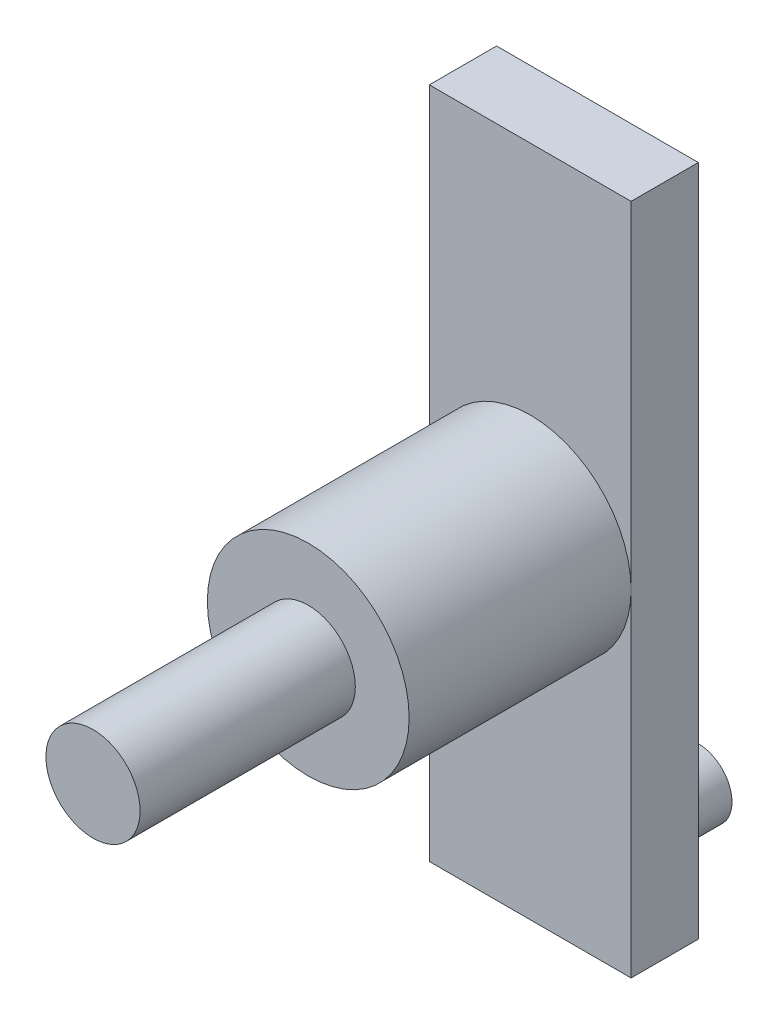
ISO-10303-21;
HEADER;
FILE_DESCRIPTION(('STEP AP214'),'2;1');
FILE_NAME('part.step','',(''),(''),'','','');
FILE_SCHEMA(('AUTOMOTIVE_DESIGN { 1 0 10303 214 1 1 1 1 }'));
ENDSEC;
DATA;
#1=APPLICATION_CONTEXT('core data for automotive mechanical design processes');
#2=APPLICATION_PROTOCOL_DEFINITION('international standard','automotive_design',2000,#1);
#3=PRODUCT_CONTEXT('',#1,'mechanical');
#4=PRODUCT('Part','Part','',(#3));
#5=PRODUCT_RELATED_PRODUCT_CATEGORY('part','',(#4));
#6=PRODUCT_DEFINITION_FORMATION('','',#4);
#7=PRODUCT_DEFINITION_CONTEXT('part definition',#1,'design');
#8=PRODUCT_DEFINITION('design','',#6,#7);
#9=PRODUCT_DEFINITION_SHAPE('','',#8);
#10=(LENGTH_UNIT() NAMED_UNIT(*) SI_UNIT(.MILLI.,.METRE.));
#11=(NAMED_UNIT(*) PLANE_ANGLE_UNIT() SI_UNIT($,.RADIAN.));
#12=(NAMED_UNIT(*) SI_UNIT($,.STERADIAN.) SOLID_ANGLE_UNIT());
#13=UNCERTAINTY_MEASURE_WITH_UNIT(LENGTH_MEASURE(1.E-05),#10,'distance_accuracy_value','');
#14=(GEOMETRIC_REPRESENTATION_CONTEXT(3) GLOBAL_UNCERTAINTY_ASSIGNED_CONTEXT((#13)) GLOBAL_UNIT_ASSIGNED_CONTEXT((#10,
#11,#12)) REPRESENTATION_CONTEXT('',''));
#15=CARTESIAN_POINT('',(0.,0.,0.));
#16=DIRECTION('',(0.,0.,1.));
#17=DIRECTION('',(1.,0.,0.));
#18=AXIS2_PLACEMENT_3D('',#15,#16,#17);
#19=CARTESIAN_POINT('',(0.,0.,65.));
#20=DIRECTION('',(0.,0.,-1.));
#21=DIRECTION('',(-1.,0.,0.));
#22=AXIS2_PLACEMENT_3D('',#19,#20,#21);
#23=CYLINDRICAL_SURFACE('',#22,7.);
#24=CARTESIAN_POINT('',(0.,0.,33.));
#25=DIRECTION('',(0.,0.,1.));
#26=DIRECTION('',(1.,0.,0.));
#27=AXIS2_PLACEMENT_3D('',#24,#25,#26);
#28=CIRCLE('',#27,7.);
#29=CARTESIAN_POINT('',(7.,0.,33.));
#30=VERTEX_POINT('',#29);
#31=EDGE_CURVE('E111',#30,#30,#28,.T.);
#32=ORIENTED_EDGE('',*,*,#31,.T.);
#33=EDGE_LOOP('',(#32));
#34=FACE_BOUND('',#33,.T.);
#35=CARTESIAN_POINT('',(0.,0.,65.));
#36=DIRECTION('',(0.,0.,1.));
#37=DIRECTION('',(1.,0.,0.));
#38=AXIS2_PLACEMENT_3D('',#35,#36,#37);
#39=CIRCLE('',#38,7.);
#40=CARTESIAN_POINT('',(7.,0.,65.));
#41=VERTEX_POINT('',#40);
#42=EDGE_CURVE('E48',#41,#41,#39,.T.);
#43=ORIENTED_EDGE('',*,*,#42,.F.);
#44=EDGE_LOOP('',(#43));
#45=FACE_BOUND('',#44,.T.);
#46=ADVANCED_FACE('F41',(#34,#45),#23,.T.);
#47=CARTESIAN_POINT('',(0.,0.,65.));
#48=DIRECTION('',(0.,0.,1.));
#49=DIRECTION('',(1.,0.,0.));
#50=AXIS2_PLACEMENT_3D('',#47,#48,#49);
#51=PLANE('',#50);
#52=ORIENTED_EDGE('',*,*,#42,.T.);
#53=EDGE_LOOP('',(#52));
#54=FACE_BOUND('',#53,.T.);
#55=ADVANCED_FACE('F127',(#54),#51,.T.);
#56=CARTESIAN_POINT('',(0.,0.,33.));
#57=DIRECTION('',(0.,0.,1.));
#58=DIRECTION('',(1.,0.,0.));
#59=AXIS2_PLACEMENT_3D('',#56,#57,#58);
#60=PLANE('',#59);
#61=CARTESIAN_POINT('',(0.,0.,33.));
#62=DIRECTION('',(0.,0.,1.));
#63=DIRECTION('',(1.,0.,0.));
#64=AXIS2_PLACEMENT_3D('',#61,#62,#63);
#65=CIRCLE('',#64,15.);
#66=CARTESIAN_POINT('',(15.,0.,33.));
#67=VERTEX_POINT('',#66);
#68=EDGE_CURVE('E119',#67,#67,#65,.T.);
#69=ORIENTED_EDGE('',*,*,#68,.T.);
#70=EDGE_LOOP('',(#69));
#71=FACE_BOUND('',#70,.T.);
#72=ORIENTED_EDGE('',*,*,#31,.F.);
#73=EDGE_LOOP('',(#72));
#74=FACE_BOUND('',#73,.T.);
#75=ADVANCED_FACE('F134',(#71,#74),#60,.T.);
#76=CARTESIAN_POINT('',(0.,0.,33.));
#77=DIRECTION('',(0.,0.,-1.));
#78=DIRECTION('',(-1.,0.,0.));
#79=AXIS2_PLACEMENT_3D('',#76,#77,#78);
#80=CYLINDRICAL_SURFACE('',#79,15.);
#81=ORIENTED_EDGE('',*,*,#68,.F.);
#82=EDGE_LOOP('',(#81));
#83=FACE_BOUND('',#82,.T.);
#84=CARTESIAN_POINT('',(0.,0.,0.));
#85=DIRECTION('',(0.,0.,1.));
#86=DIRECTION('',(1.,0.,0.));
#87=AXIS2_PLACEMENT_3D('',#84,#85,#86);
#88=CIRCLE('',#87,15.);
#89=CARTESIAN_POINT('',(15.,0.,0.));
#90=VERTEX_POINT('',#89);
#91=CARTESIAN_POINT('',(-15.,0.,0.));
#92=VERTEX_POINT('',#91);
#93=EDGE_CURVE('E122',#90,#92,#88,.T.);
#94=ORIENTED_EDGE('',*,*,#93,.T.);
#95=EDGE_CURVE('E62',#92,#90,#88,.T.);
#96=ORIENTED_EDGE('',*,*,#95,.T.);
#97=EDGE_LOOP('',(#94,#96));
#98=FACE_BOUND('',#97,.T.);
#99=ADVANCED_FACE('F138',(#83,#98),#80,.T.);
#100=CARTESIAN_POINT('',(0.,0.,0.));
#101=DIRECTION('',(0.,0.,1.));
#102=DIRECTION('',(1.,0.,0.));
#103=AXIS2_PLACEMENT_3D('',#100,#101,#102);
#104=PLANE('',#103);
#105=ORIENTED_EDGE('',*,*,#93,.F.);
#106=DIRECTION('',(0.,-1.,0.));
#107=VECTOR('',#106,1.);
#108=CARTESIAN_POINT('',(15.,50.,0.));
#109=LINE('',#108,#107);
#110=CARTESIAN_POINT('',(15.,50.,0.));
#111=VERTEX_POINT('',#110);
#112=EDGE_CURVE('E55',#111,#90,#109,.T.);
#113=ORIENTED_EDGE('',*,*,#112,.F.);
#114=DIRECTION('',(1.,0.,0.));
#115=VECTOR('',#114,1.);
#116=CARTESIAN_POINT('',(-15.,50.,0.));
#117=LINE('',#116,#115);
#118=CARTESIAN_POINT('',(-15.,50.,0.));
#119=VERTEX_POINT('',#118);
#120=EDGE_CURVE('E106',#119,#111,#117,.T.);
#121=ORIENTED_EDGE('',*,*,#120,.F.);
#122=DIRECTION('',(0.,1.,0.));
#123=VECTOR('',#122,1.);
#124=CARTESIAN_POINT('',(-15.,50.,0.));
#125=LINE('',#124,#123);
#126=EDGE_CURVE('E187',#92,#119,#125,.T.);
#127=ORIENTED_EDGE('',*,*,#126,.F.);
#128=EDGE_LOOP('',(#105,#113,#121,#127));
#129=FACE_BOUND('',#128,.T.);
#130=ADVANCED_FACE('F144',(#129),#104,.T.);
#131=ORIENTED_EDGE('',*,*,#95,.F.);
#132=CARTESIAN_POINT('',(-15.,-50.,0.));
#133=VERTEX_POINT('',#132);
#134=EDGE_CURVE('E188',#133,#92,#125,.T.);
#135=ORIENTED_EDGE('',*,*,#134,.F.);
#136=DIRECTION('',(-1.,0.,0.));
#137=VECTOR('',#136,1.);
#138=CARTESIAN_POINT('',(-15.,-50.,0.));
#139=LINE('',#138,#137);
#140=CARTESIAN_POINT('',(15.,-50.,0.));
#141=VERTEX_POINT('',#140);
#142=EDGE_CURVE('E185',#141,#133,#139,.T.);
#143=ORIENTED_EDGE('',*,*,#142,.F.);
#144=EDGE_CURVE('E109',#90,#141,#109,.T.);
#145=ORIENTED_EDGE('',*,*,#144,.F.);
#146=EDGE_LOOP('',(#131,#135,#143,#145));
#147=FACE_BOUND('',#146,.T.);
#148=ADVANCED_FACE('F150',(#147),#104,.T.);
#149=CARTESIAN_POINT('',(15.,50.,-10.));
#150=DIRECTION('',(-1.,0.,0.));
#151=DIRECTION('',(0.,-1.,0.));
#152=AXIS2_PLACEMENT_3D('',#149,#150,#151);
#153=PLANE('',#152);
#154=ORIENTED_EDGE('',*,*,#112,.T.);
#155=ORIENTED_EDGE('',*,*,#144,.T.);
#156=DIRECTION('',(0.,0.,1.));
#157=VECTOR('',#156,1.);
#158=CARTESIAN_POINT('',(15.,-50.,-10.));
#159=LINE('',#158,#157);
#160=CARTESIAN_POINT('',(15.,-50.,-10.));
#161=VERTEX_POINT('',#160);
#162=EDGE_CURVE('E93',#161,#141,#159,.T.);
#163=ORIENTED_EDGE('',*,*,#162,.F.);
#164=DIRECTION('',(0.,-1.,0.));
#165=VECTOR('',#164,1.);
#166=CARTESIAN_POINT('',(15.,50.,-10.));
#167=LINE('',#166,#165);
#168=CARTESIAN_POINT('',(15.,50.,-10.));
#169=VERTEX_POINT('',#168);
#170=EDGE_CURVE('E99',#169,#161,#167,.T.);
#171=ORIENTED_EDGE('',*,*,#170,.F.);
#172=DIRECTION('',(0.,0.,1.));
#173=VECTOR('',#172,1.);
#174=CARTESIAN_POINT('',(15.,50.,-10.));
#175=LINE('',#174,#173);
#176=EDGE_CURVE('E183',#169,#111,#175,.T.);
#177=ORIENTED_EDGE('',*,*,#176,.T.);
#178=EDGE_LOOP('',(#154,#155,#163,#171,#177));
#179=FACE_BOUND('',#178,.T.);
#180=ADVANCED_FACE('F108',(#179),#153,.F.);
#181=CARTESIAN_POINT('',(-15.,-50.,-10.));
#182=DIRECTION('',(0.,1.,0.));
#183=DIRECTION('',(-1.,0.,0.));
#184=AXIS2_PLACEMENT_3D('',#181,#182,#183);
#185=PLANE('',#184);
#186=ORIENTED_EDGE('',*,*,#142,.T.);
#187=DIRECTION('',(0.,0.,1.));
#188=VECTOR('',#187,1.);
#189=CARTESIAN_POINT('',(-15.,-50.,-10.));
#190=LINE('',#189,#188);
#191=CARTESIAN_POINT('',(-15.,-50.,-10.));
#192=VERTEX_POINT('',#191);
#193=EDGE_CURVE('E95',#192,#133,#190,.T.);
#194=ORIENTED_EDGE('',*,*,#193,.F.);
#195=DIRECTION('',(-1.,0.,0.));
#196=VECTOR('',#195,1.);
#197=CARTESIAN_POINT('',(-15.,-50.,-10.));
#198=LINE('',#197,#196);
#199=EDGE_CURVE('E89',#161,#192,#198,.T.);
#200=ORIENTED_EDGE('',*,*,#199,.F.);
#201=ORIENTED_EDGE('',*,*,#162,.T.);
#202=EDGE_LOOP('',(#186,#194,#200,#201));
#203=FACE_BOUND('',#202,.T.);
#204=ADVANCED_FACE('F91',(#203),#185,.F.);
#205=CARTESIAN_POINT('',(-15.,50.,-10.));
#206=DIRECTION('',(1.,0.,0.));
#207=DIRECTION('',(0.,1.,0.));
#208=AXIS2_PLACEMENT_3D('',#205,#206,#207);
#209=PLANE('',#208);
#210=ORIENTED_EDGE('',*,*,#134,.T.);
#211=ORIENTED_EDGE('',*,*,#126,.T.);
#212=DIRECTION('',(0.,0.,1.));
#213=VECTOR('',#212,1.);
#214=CARTESIAN_POINT('',(-15.,50.,-10.));
#215=LINE('',#214,#213);
#216=CARTESIAN_POINT('',(-15.,50.,-10.));
#217=VERTEX_POINT('',#216);
#218=EDGE_CURVE('E115',#217,#119,#215,.T.);
#219=ORIENTED_EDGE('',*,*,#218,.F.);
#220=DIRECTION('',(0.,1.,0.));
#221=VECTOR('',#220,1.);
#222=CARTESIAN_POINT('',(-15.,50.,-10.));
#223=LINE('',#222,#221);
#224=EDGE_CURVE('E98',#192,#217,#223,.T.);
#225=ORIENTED_EDGE('',*,*,#224,.F.);
#226=ORIENTED_EDGE('',*,*,#193,.T.);
#227=EDGE_LOOP('',(#210,#211,#219,#225,#226));
#228=FACE_BOUND('',#227,.T.);
#229=ADVANCED_FACE('F153',(#228),#209,.F.);
#230=CARTESIAN_POINT('',(-15.,50.,-10.));
#231=DIRECTION('',(0.,-1.,0.));
#232=DIRECTION('',(1.,0.,0.));
#233=AXIS2_PLACEMENT_3D('',#230,#231,#232);
#234=PLANE('',#233);
#235=ORIENTED_EDGE('',*,*,#120,.T.);
#236=ORIENTED_EDGE('',*,*,#176,.F.);
#237=DIRECTION('',(1.,0.,0.));
#238=VECTOR('',#237,1.);
#239=CARTESIAN_POINT('',(-15.,50.,-10.));
#240=LINE('',#239,#238);
#241=EDGE_CURVE('E104',#217,#169,#240,.T.);
#242=ORIENTED_EDGE('',*,*,#241,.F.);
#243=ORIENTED_EDGE('',*,*,#218,.T.);
#244=EDGE_LOOP('',(#235,#236,#242,#243));
#245=FACE_BOUND('',#244,.T.);
#246=ADVANCED_FACE('F156',(#245),#234,.F.);
#247=CARTESIAN_POINT('',(0.,0.,-10.));
#248=DIRECTION('',(0.,0.,1.));
#249=DIRECTION('',(1.,0.,0.));
#250=AXIS2_PLACEMENT_3D('',#247,#248,#249);
#251=PLANE('',#250);
#252=CARTESIAN_POINT('',(0.,-44.8338709372042,-10.));
#253=DIRECTION('',(0.,0.,1.));
#254=DIRECTION('',(1.,0.,0.));
#255=AXIS2_PLACEMENT_3D('',#252,#253,#254);
#256=CIRCLE('',#255,5.);
#257=CARTESIAN_POINT('',(5.,-44.8338709372042,-10.));
#258=VERTEX_POINT('',#257);
#259=EDGE_CURVE('E11',#258,#258,#256,.F.);
#260=ORIENTED_EDGE('',*,*,#259,.F.);
#261=EDGE_LOOP('',(#260));
#262=FACE_BOUND('',#261,.T.);
#263=ORIENTED_EDGE('',*,*,#170,.T.);
#264=ORIENTED_EDGE('',*,*,#199,.T.);
#265=ORIENTED_EDGE('',*,*,#224,.T.);
#266=ORIENTED_EDGE('',*,*,#241,.T.);
#267=EDGE_LOOP('',(#263,#264,#265,#266));
#268=FACE_BOUND('',#267,.T.);
#269=ADVANCED_FACE('F102',(#262,#268),#251,.F.);
#270=CARTESIAN_POINT('',(0.,-44.8338709372042,-25.));
#271=DIRECTION('',(0.,0.,1.));
#272=DIRECTION('',(1.,0.,0.));
#273=AXIS2_PLACEMENT_3D('',#270,#271,#272);
#274=CYLINDRICAL_SURFACE('',#273,5.);
#275=CARTESIAN_POINT('',(0.,-44.8338709372042,-25.));
#276=DIRECTION('',(0.,0.,-1.));
#277=DIRECTION('',(-1.,0.,0.));
#278=AXIS2_PLACEMENT_3D('',#275,#276,#277);
#279=CIRCLE('',#278,5.);
#280=CARTESIAN_POINT('',(-5.,-44.8338709372042,-25.));
#281=VERTEX_POINT('',#280);
#282=EDGE_CURVE('E178',#281,#281,#279,.T.);
#283=ORIENTED_EDGE('',*,*,#282,.F.);
#284=EDGE_LOOP('',(#283));
#285=FACE_BOUND('',#284,.T.);
#286=ORIENTED_EDGE('',*,*,#259,.T.);
#287=EDGE_LOOP('',(#286));
#288=FACE_BOUND('',#287,.T.);
#289=ADVANCED_FACE('F166',(#285,#288),#274,.T.);
#290=CARTESIAN_POINT('',(0.,-44.8338709372042,-25.));
#291=DIRECTION('',(0.,0.,-1.));
#292=DIRECTION('',(-1.,0.,0.));
#293=AXIS2_PLACEMENT_3D('',#290,#291,#292);
#294=PLANE('',#293);
#295=ORIENTED_EDGE('',*,*,#282,.T.);
#296=EDGE_LOOP('',(#295));
#297=FACE_BOUND('',#296,.T.);
#298=ADVANCED_FACE('F170',(#297),#294,.T.);
#299=CLOSED_SHELL('',(#46,#55,#75,#99,#130,#148,#180,#204,#229,#246,#269,#289,#298));
#300=MANIFOLD_SOLID_BREP('B2',#299);
#301=ADVANCED_BREP_SHAPE_REPRESENTATION('',(#18,#300),#14);
#302=SHAPE_DEFINITION_REPRESENTATION(#9,#301);
ENDSEC;
END-ISO-10303-21;
